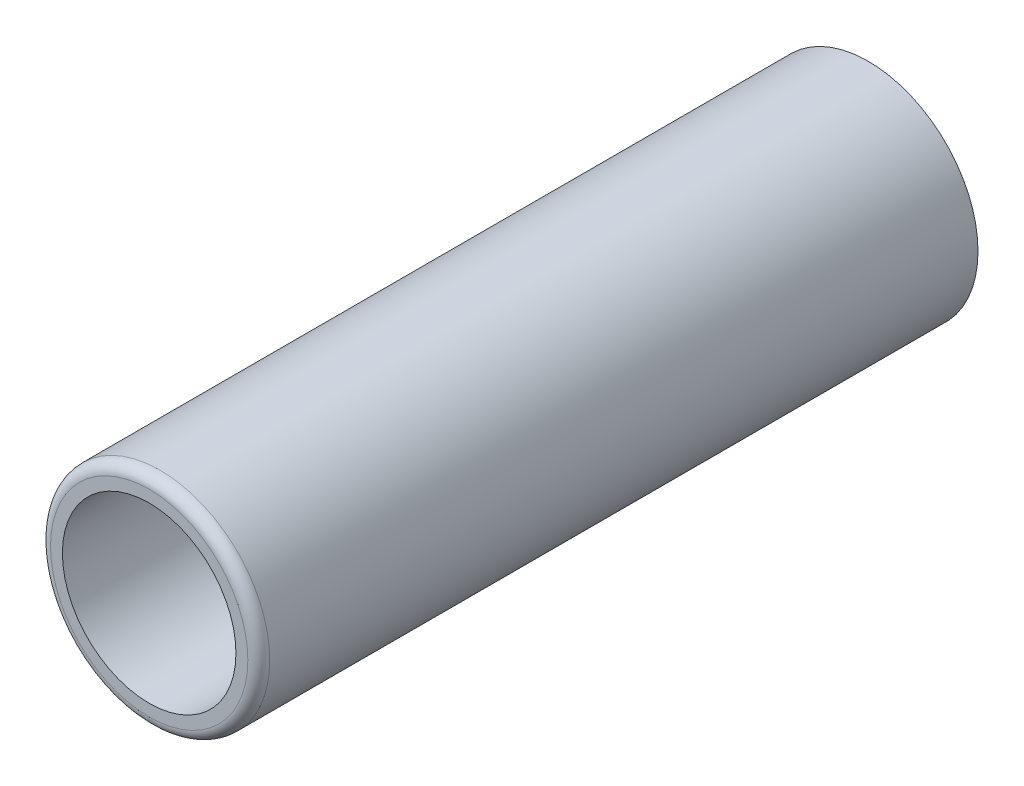
ISO-10303-21;
HEADER;
FILE_DESCRIPTION(('STEP AP214'),'2;1');
FILE_NAME('part.step','',(''),(''),'','','');
FILE_SCHEMA(('AUTOMOTIVE_DESIGN { 1 0 10303 214 1 1 1 1 }'));
ENDSEC;
DATA;
#1=APPLICATION_CONTEXT('core data for automotive mechanical design processes');
#2=APPLICATION_PROTOCOL_DEFINITION('international standard','automotive_design',2000,#1);
#3=PRODUCT_CONTEXT('',#1,'mechanical');
#4=PRODUCT('Part','Part','',(#3));
#5=PRODUCT_RELATED_PRODUCT_CATEGORY('part','',(#4));
#6=PRODUCT_DEFINITION_FORMATION('','',#4);
#7=PRODUCT_DEFINITION_CONTEXT('part definition',#1,'design');
#8=PRODUCT_DEFINITION('design','',#6,#7);
#9=PRODUCT_DEFINITION_SHAPE('','',#8);
#10=(LENGTH_UNIT() NAMED_UNIT(*) SI_UNIT(.MILLI.,.METRE.));
#11=(NAMED_UNIT(*) PLANE_ANGLE_UNIT() SI_UNIT($,.RADIAN.));
#12=(NAMED_UNIT(*) SI_UNIT($,.STERADIAN.) SOLID_ANGLE_UNIT());
#13=UNCERTAINTY_MEASURE_WITH_UNIT(LENGTH_MEASURE(1.E-05),#10,'distance_accuracy_value','');
#14=(GEOMETRIC_REPRESENTATION_CONTEXT(3) GLOBAL_UNCERTAINTY_ASSIGNED_CONTEXT((#13)) GLOBAL_UNIT_ASSIGNED_CONTEXT((#10,
#11,#12)) REPRESENTATION_CONTEXT('',''));
#15=CARTESIAN_POINT('',(0.,0.,0.));
#16=DIRECTION('',(0.,0.,1.));
#17=DIRECTION('',(1.,0.,0.));
#18=AXIS2_PLACEMENT_3D('',#15,#16,#17);
#19=CARTESIAN_POINT('',(0.,0.,108.42));
#20=DIRECTION('',(0.,0.,-1.));
#21=DIRECTION('',(-1.,0.,0.));
#22=AXIS2_PLACEMENT_3D('',#19,#20,#21);
#23=CYLINDRICAL_SURFACE('',#22,7.62);
#24=CARTESIAN_POINT('',(0.,0.,107.658));
#25=DIRECTION('',(0.,0.,1.));
#26=DIRECTION('',(1.,0.,0.));
#27=AXIS2_PLACEMENT_3D('',#24,#25,#26);
#28=CIRCLE('',#27,7.62);
#29=CARTESIAN_POINT('',(7.62,0.,107.658));
#30=VERTEX_POINT('',#29);
#31=EDGE_CURVE('E10',#30,#30,#28,.F.);
#32=ORIENTED_EDGE('',*,*,#31,.T.);
#33=EDGE_LOOP('',(#32));
#34=FACE_BOUND('',#33,.T.);
#35=CARTESIAN_POINT('',(0.,0.,58.42));
#36=DIRECTION('',(0.,0.,1.));
#37=DIRECTION('',(1.,0.,0.));
#38=AXIS2_PLACEMENT_3D('',#35,#36,#37);
#39=CIRCLE('',#38,7.62);
#40=CARTESIAN_POINT('',(7.62,0.,58.42));
#41=VERTEX_POINT('',#40);
#42=EDGE_CURVE('E43',#41,#41,#39,.T.);
#43=ORIENTED_EDGE('',*,*,#42,.T.);
#44=EDGE_LOOP('',(#43));
#45=FACE_BOUND('',#44,.T.);
#46=ADVANCED_FACE('F32',(#34,#45),#23,.T.);
#47=CARTESIAN_POINT('',(0.,0.,108.42));
#48=DIRECTION('',(0.,0.,1.));
#49=DIRECTION('',(1.,0.,0.));
#50=AXIS2_PLACEMENT_3D('',#47,#48,#49);
#51=PLANE('',#50);
#52=CARTESIAN_POINT('',(0.,0.,108.42));
#53=DIRECTION('',(0.,0.,1.));
#54=DIRECTION('',(1.,0.,0.));
#55=AXIS2_PLACEMENT_3D('',#52,#53,#54);
#56=CIRCLE('',#55,6.858);
#57=CARTESIAN_POINT('',(6.858,0.,108.42));
#58=VERTEX_POINT('',#57);
#59=EDGE_CURVE('E39',#58,#58,#56,.T.);
#60=ORIENTED_EDGE('',*,*,#59,.T.);
#61=EDGE_LOOP('',(#60));
#62=FACE_BOUND('',#61,.T.);
#63=CARTESIAN_POINT('',(0.,0.,108.42));
#64=DIRECTION('',(0.,0.,1.));
#65=DIRECTION('',(1.,0.,0.));
#66=AXIS2_PLACEMENT_3D('',#63,#64,#65);
#67=CIRCLE('',#66,6.0325);
#68=CARTESIAN_POINT('',(6.0325,0.,108.42));
#69=VERTEX_POINT('',#68);
#70=EDGE_CURVE('E51',#69,#69,#67,.T.);
#71=ORIENTED_EDGE('',*,*,#70,.F.);
#72=EDGE_LOOP('',(#71));
#73=FACE_BOUND('',#72,.T.);
#74=ADVANCED_FACE('F59',(#62,#73),#51,.T.);
#75=CARTESIAN_POINT('',(0.,0.,58.42));
#76=DIRECTION('',(0.,0.,1.));
#77=DIRECTION('',(1.,0.,0.));
#78=AXIS2_PLACEMENT_3D('',#75,#76,#77);
#79=PLANE('',#78);
#80=CARTESIAN_POINT('',(0.,0.,58.42));
#81=DIRECTION('',(0.,0.,1.));
#82=DIRECTION('',(1.,0.,0.));
#83=AXIS2_PLACEMENT_3D('',#80,#81,#82);
#84=CIRCLE('',#83,6.0325);
#85=CARTESIAN_POINT('',(6.0325,0.,58.42));
#86=VERTEX_POINT('',#85);
#87=EDGE_CURVE('E47',#86,#86,#84,.T.);
#88=ORIENTED_EDGE('',*,*,#87,.T.);
#89=EDGE_LOOP('',(#88));
#90=FACE_BOUND('',#89,.T.);
#91=ORIENTED_EDGE('',*,*,#42,.F.);
#92=EDGE_LOOP('',(#91));
#93=FACE_BOUND('',#92,.T.);
#94=ADVANCED_FACE('F61',(#90,#93),#79,.F.);
#95=CARTESIAN_POINT('',(0.,0.,0.));
#96=DIRECTION('',(0.,0.,1.));
#97=DIRECTION('',(1.,0.,0.));
#98=AXIS2_PLACEMENT_3D('',#95,#96,#97);
#99=CYLINDRICAL_SURFACE('',#98,6.0325);
#100=ORIENTED_EDGE('',*,*,#70,.T.);
#101=EDGE_LOOP('',(#100));
#102=FACE_BOUND('',#101,.T.);
#103=ORIENTED_EDGE('',*,*,#87,.F.);
#104=EDGE_LOOP('',(#103));
#105=FACE_BOUND('',#104,.T.);
#106=ADVANCED_FACE('F56',(#102,#105),#99,.F.);
#107=CARTESIAN_POINT('',(0.,0.,107.658));
#108=DIRECTION('',(0.,0.,1.));
#109=DIRECTION('',(1.,0.,0.));
#110=AXIS2_PLACEMENT_3D('',#107,#108,#109);
#111=TOROIDAL_SURFACE('',#110,6.858,0.762);
#112=ORIENTED_EDGE('',*,*,#31,.F.);
#113=EDGE_LOOP('',(#112));
#114=FACE_BOUND('',#113,.T.);
#115=ORIENTED_EDGE('',*,*,#59,.F.);
#116=EDGE_LOOP('',(#115));
#117=FACE_BOUND('',#116,.T.);
#118=ADVANCED_FACE('F34',(#114,#117),#111,.T.);
#119=CLOSED_SHELL('',(#46,#74,#94,#106,#118));
#120=MANIFOLD_SOLID_BREP('B2',#119);
#121=ADVANCED_BREP_SHAPE_REPRESENTATION('',(#18,#120),#14);
#122=SHAPE_DEFINITION_REPRESENTATION(#9,#121);
ENDSEC;
END-ISO-10303-21;
